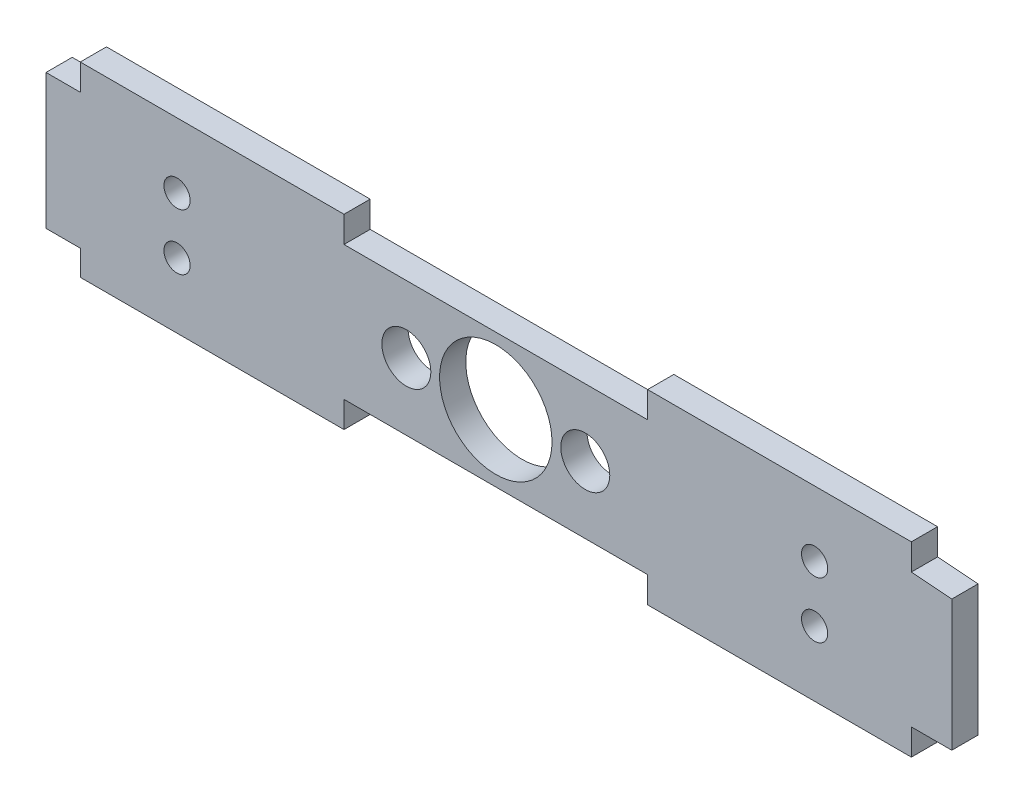
ISO-10303-21;
HEADER;
FILE_DESCRIPTION(('STEP AP214'),'2;1');
FILE_NAME('part.step','',(''),(''),'','','');
FILE_SCHEMA(('AUTOMOTIVE_DESIGN { 1 0 10303 214 1 1 1 1 }'));
ENDSEC;
DATA;
#1=APPLICATION_CONTEXT('core data for automotive mechanical design processes');
#2=APPLICATION_PROTOCOL_DEFINITION('international standard','automotive_design',2000,#1);
#3=PRODUCT_CONTEXT('',#1,'mechanical');
#4=PRODUCT('Part','Part','',(#3));
#5=PRODUCT_RELATED_PRODUCT_CATEGORY('part','',(#4));
#6=PRODUCT_DEFINITION_FORMATION('','',#4);
#7=PRODUCT_DEFINITION_CONTEXT('part definition',#1,'design');
#8=PRODUCT_DEFINITION('design','',#6,#7);
#9=PRODUCT_DEFINITION_SHAPE('','',#8);
#10=(LENGTH_UNIT() NAMED_UNIT(*) SI_UNIT(.MILLI.,.METRE.));
#11=(NAMED_UNIT(*) PLANE_ANGLE_UNIT() SI_UNIT($,.RADIAN.));
#12=(NAMED_UNIT(*) SI_UNIT($,.STERADIAN.) SOLID_ANGLE_UNIT());
#13=UNCERTAINTY_MEASURE_WITH_UNIT(LENGTH_MEASURE(1.E-05),#10,'distance_accuracy_value','');
#14=(GEOMETRIC_REPRESENTATION_CONTEXT(3) GLOBAL_UNCERTAINTY_ASSIGNED_CONTEXT((#13)) GLOBAL_UNIT_ASSIGNED_CONTEXT((#10,
#11,#12)) REPRESENTATION_CONTEXT('',''));
#15=CARTESIAN_POINT('',(0.,0.,0.));
#16=DIRECTION('',(0.,0.,1.));
#17=DIRECTION('',(1.,0.,0.));
#18=AXIS2_PLACEMENT_3D('',#15,#16,#17);
#19=CARTESIAN_POINT('',(-22.3101445281848,0.,5.08));
#20=DIRECTION('',(-1.,0.,0.));
#21=DIRECTION('',(0.,0.,1.));
#22=AXIS2_PLACEMENT_3D('',#19,#20,#21);
#23=PLANE('',#22);
#24=DIRECTION('',(0.,1.,0.));
#25=VECTOR('',#24,1.);
#26=CARTESIAN_POINT('',(-22.3101445281848,0.,0.));
#27=LINE('',#26,#25);
#28=CARTESIAN_POINT('',(-22.3101445281848,-25.7868973944509,0.));
#29=VERTEX_POINT('',#28);
#30=CARTESIAN_POINT('',(-22.3101445281848,-20.7068973944509,0.));
#31=VERTEX_POINT('',#30);
#32=EDGE_CURVE('E226',#29,#31,#27,.T.);
#33=ORIENTED_EDGE('',*,*,#32,.T.);
#34=DIRECTION('',(0.,0.,-1.));
#35=VECTOR('',#34,1.);
#36=CARTESIAN_POINT('',(-22.3101445281848,-20.7068973944509,5.08));
#37=LINE('',#36,#35);
#38=CARTESIAN_POINT('',(-22.3101445281848,-20.7068973944509,5.08));
#39=VERTEX_POINT('',#38);
#40=EDGE_CURVE('E11',#39,#31,#37,.T.);
#41=ORIENTED_EDGE('',*,*,#40,.F.);
#42=DIRECTION('',(0.,1.,0.));
#43=VECTOR('',#42,1.);
#44=CARTESIAN_POINT('',(-22.3101445281848,0.,5.08));
#45=LINE('',#44,#43);
#46=CARTESIAN_POINT('',(-22.3101445281848,-25.7868973944509,5.08));
#47=VERTEX_POINT('',#46);
#48=EDGE_CURVE('E387',#47,#39,#45,.T.);
#49=ORIENTED_EDGE('',*,*,#48,.F.);
#50=DIRECTION('',(0.,0.,-1.));
#51=VECTOR('',#50,1.);
#52=CARTESIAN_POINT('',(-22.3101445281848,-25.7868973944509,5.08));
#53=LINE('',#52,#51);
#54=EDGE_CURVE('E219',#47,#29,#53,.T.);
#55=ORIENTED_EDGE('',*,*,#54,.T.);
#56=EDGE_LOOP('',(#33,#41,#49,#55));
#57=FACE_BOUND('',#56,.T.);
#58=ADVANCED_FACE('F35',(#57),#23,.F.);
#59=CARTESIAN_POINT('',(0.,-20.7068973944509,5.08));
#60=DIRECTION('',(0.,-1.,0.));
#61=DIRECTION('',(0.,0.,-1.));
#62=AXIS2_PLACEMENT_3D('',#59,#60,#61);
#63=PLANE('',#62);
#64=DIRECTION('',(-1.,0.,0.));
#65=VECTOR('',#64,1.);
#66=CARTESIAN_POINT('',(0.,-20.7068973944509,0.));
#67=LINE('',#66,#65);
#68=CARTESIAN_POINT('',(-73.4438574464147,-20.7068973944509,0.));
#69=VERTEX_POINT('',#68);
#70=EDGE_CURVE('E229',#31,#69,#67,.T.);
#71=ORIENTED_EDGE('',*,*,#70,.T.);
#72=DIRECTION('',(0.,0.,-1.));
#73=VECTOR('',#72,1.);
#74=CARTESIAN_POINT('',(-73.4438574464147,-20.7068973944509,5.08));
#75=LINE('',#74,#73);
#76=CARTESIAN_POINT('',(-73.4438574464147,-20.7068973944509,5.08));
#77=VERTEX_POINT('',#76);
#78=EDGE_CURVE('E44',#77,#69,#75,.T.);
#79=ORIENTED_EDGE('',*,*,#78,.F.);
#80=DIRECTION('',(-1.,0.,0.));
#81=VECTOR('',#80,1.);
#82=CARTESIAN_POINT('',(0.,-20.7068973944509,5.08));
#83=LINE('',#82,#81);
#84=EDGE_CURVE('E131',#39,#77,#83,.T.);
#85=ORIENTED_EDGE('',*,*,#84,.F.);
#86=ORIENTED_EDGE('',*,*,#40,.T.);
#87=EDGE_LOOP('',(#71,#79,#85,#86));
#88=FACE_BOUND('',#87,.T.);
#89=ADVANCED_FACE('F403',(#88),#63,.F.);
#90=CARTESIAN_POINT('',(-73.4438574464147,0.,5.08));
#91=DIRECTION('',(1.,0.,0.));
#92=DIRECTION('',(0.,0.,-1.));
#93=AXIS2_PLACEMENT_3D('',#90,#91,#92);
#94=PLANE('',#93);
#95=DIRECTION('',(0.,-1.,0.));
#96=VECTOR('',#95,1.);
#97=CARTESIAN_POINT('',(-73.4438574464147,0.,0.));
#98=LINE('',#97,#96);
#99=CARTESIAN_POINT('',(-73.4438574464147,-25.7868973944509,0.));
#100=VERTEX_POINT('',#99);
#101=EDGE_CURVE('E231',#69,#100,#98,.T.);
#102=ORIENTED_EDGE('',*,*,#101,.T.);
#103=DIRECTION('',(0.,0.,-1.));
#104=VECTOR('',#103,1.);
#105=CARTESIAN_POINT('',(-73.4438574464147,-25.7868973944509,5.08));
#106=LINE('',#105,#104);
#107=CARTESIAN_POINT('',(-73.4438574464147,-25.7868973944509,5.08));
#108=VERTEX_POINT('',#107);
#109=EDGE_CURVE('E322',#108,#100,#106,.T.);
#110=ORIENTED_EDGE('',*,*,#109,.F.);
#111=DIRECTION('',(0.,-1.,0.));
#112=VECTOR('',#111,1.);
#113=CARTESIAN_POINT('',(-73.4438574464147,0.,5.08));
#114=LINE('',#113,#112);
#115=EDGE_CURVE('E330',#77,#108,#114,.T.);
#116=ORIENTED_EDGE('',*,*,#115,.F.);
#117=ORIENTED_EDGE('',*,*,#78,.T.);
#118=EDGE_LOOP('',(#102,#110,#116,#117));
#119=FACE_BOUND('',#118,.T.);
#120=ADVANCED_FACE('F328',(#119),#94,.F.);
#121=CARTESIAN_POINT('',(0.,-25.7868973944509,5.08));
#122=DIRECTION('',(0.,-1.,0.));
#123=DIRECTION('',(0.,0.,-1.));
#124=AXIS2_PLACEMENT_3D('',#121,#122,#123);
#125=PLANE('',#124);
#126=DIRECTION('',(-1.,0.,0.));
#127=VECTOR('',#126,1.);
#128=CARTESIAN_POINT('',(0.,-25.7868973944509,0.));
#129=LINE('',#128,#127);
#130=CARTESIAN_POINT('',(-80.0879049182557,-25.7868973944509,0.));
#131=VERTEX_POINT('',#130);
#132=EDGE_CURVE('E233',#100,#131,#129,.T.);
#133=ORIENTED_EDGE('',*,*,#132,.T.);
#134=DIRECTION('',(0.,0.,-1.));
#135=VECTOR('',#134,1.);
#136=CARTESIAN_POINT('',(-80.0879049182557,-25.7868973944509,5.08));
#137=LINE('',#136,#135);
#138=CARTESIAN_POINT('',(-80.0879049182557,-25.7868973944509,5.08));
#139=VERTEX_POINT('',#138);
#140=EDGE_CURVE('E319',#139,#131,#137,.T.);
#141=ORIENTED_EDGE('',*,*,#140,.F.);
#142=DIRECTION('',(-1.,0.,0.));
#143=VECTOR('',#142,1.);
#144=CARTESIAN_POINT('',(0.,-25.7868973944509,5.08));
#145=LINE('',#144,#143);
#146=EDGE_CURVE('E349',#108,#139,#145,.T.);
#147=ORIENTED_EDGE('',*,*,#146,.F.);
#148=ORIENTED_EDGE('',*,*,#109,.T.);
#149=EDGE_LOOP('',(#133,#141,#147,#148));
#150=FACE_BOUND('',#149,.T.);
#151=ADVANCED_FACE('F340',(#150),#125,.F.);
#152=CARTESIAN_POINT('',(-80.0879049182557,0.,5.08));
#153=DIRECTION('',(1.,0.,0.));
#154=DIRECTION('',(0.,0.,-1.));
#155=AXIS2_PLACEMENT_3D('',#152,#153,#154);
#156=PLANE('',#155);
#157=DIRECTION('',(0.,-1.,0.));
#158=VECTOR('',#157,1.);
#159=CARTESIAN_POINT('',(-80.0879049182557,0.,0.));
#160=LINE('',#159,#158);
#161=CARTESIAN_POINT('',(-80.0879049182557,-51.975164852653,0.));
#162=VERTEX_POINT('',#161);
#163=EDGE_CURVE('E235',#131,#162,#160,.T.);
#164=ORIENTED_EDGE('',*,*,#163,.T.);
#165=DIRECTION('',(0.,0.,-1.));
#166=VECTOR('',#165,1.);
#167=CARTESIAN_POINT('',(-80.0879049182557,-51.975164852653,5.08));
#168=LINE('',#167,#166);
#169=CARTESIAN_POINT('',(-80.0879049182557,-51.975164852653,5.08));
#170=VERTEX_POINT('',#169);
#171=EDGE_CURVE('E316',#170,#162,#168,.T.);
#172=ORIENTED_EDGE('',*,*,#171,.F.);
#173=DIRECTION('',(0.,-1.,0.));
#174=VECTOR('',#173,1.);
#175=CARTESIAN_POINT('',(-80.0879049182557,0.,5.08));
#176=LINE('',#175,#174);
#177=EDGE_CURVE('E346',#139,#170,#176,.T.);
#178=ORIENTED_EDGE('',*,*,#177,.F.);
#179=ORIENTED_EDGE('',*,*,#140,.T.);
#180=EDGE_LOOP('',(#164,#172,#178,#179));
#181=FACE_BOUND('',#180,.T.);
#182=ADVANCED_FACE('F344',(#181),#156,.F.);
#183=CARTESIAN_POINT('',(0.,-51.975164852653,5.08));
#184=DIRECTION('',(0.,1.,0.));
#185=DIRECTION('',(0.,0.,1.));
#186=AXIS2_PLACEMENT_3D('',#183,#184,#185);
#187=PLANE('',#186);
#188=DIRECTION('',(1.,0.,0.));
#189=VECTOR('',#188,1.);
#190=CARTESIAN_POINT('',(0.,-51.975164852653,0.));
#191=LINE('',#190,#189);
#192=CARTESIAN_POINT('',(-73.4438574464147,-51.975164852653,0.));
#193=VERTEX_POINT('',#192);
#194=EDGE_CURVE('E237',#162,#193,#191,.T.);
#195=ORIENTED_EDGE('',*,*,#194,.T.);
#196=DIRECTION('',(0.,0.,-1.));
#197=VECTOR('',#196,1.);
#198=CARTESIAN_POINT('',(-73.4438574464147,-51.975164852653,5.08));
#199=LINE('',#198,#197);
#200=CARTESIAN_POINT('',(-73.4438574464147,-51.975164852653,5.08));
#201=VERTEX_POINT('',#200);
#202=EDGE_CURVE('E313',#201,#193,#199,.T.);
#203=ORIENTED_EDGE('',*,*,#202,.F.);
#204=DIRECTION('',(1.,0.,0.));
#205=VECTOR('',#204,1.);
#206=CARTESIAN_POINT('',(0.,-51.975164852653,5.08));
#207=LINE('',#206,#205);
#208=EDGE_CURVE('E348',#170,#201,#207,.T.);
#209=ORIENTED_EDGE('',*,*,#208,.F.);
#210=ORIENTED_EDGE('',*,*,#171,.T.);
#211=EDGE_LOOP('',(#195,#203,#209,#210));
#212=FACE_BOUND('',#211,.T.);
#213=ADVANCED_FACE('F416',(#212),#187,.F.);
#214=CARTESIAN_POINT('',(-73.453283826461,-0.0133251357682893,5.08));
#215=DIRECTION('',(0.999999983545267,0.000181409664141217,0.));
#216=DIRECTION('',(-0.000181409664141217,0.999999983545267,0.));
#217=AXIS2_PLACEMENT_3D('',#214,#215,#216);
#218=PLANE('',#217);
#219=DIRECTION('',(0.000181409664141217,-0.999999983545267,0.));
#220=VECTOR('',#219,1.);
#221=CARTESIAN_POINT('',(-73.453283826461,-0.0133251357682893,0.));
#222=LINE('',#221,#220);
#223=CARTESIAN_POINT('',(-73.4429700388426,-56.8668973944509,0.));
#224=VERTEX_POINT('',#223);
#225=EDGE_CURVE('E239',#193,#224,#222,.T.);
#226=ORIENTED_EDGE('',*,*,#225,.T.);
#227=DIRECTION('',(0.,0.,-1.));
#228=VECTOR('',#227,1.);
#229=CARTESIAN_POINT('',(-73.4429700388426,-56.8668973944509,5.08));
#230=LINE('',#229,#228);
#231=CARTESIAN_POINT('',(-73.4429700388426,-56.8668973944509,5.08));
#232=VERTEX_POINT('',#231);
#233=EDGE_CURVE('E310',#232,#224,#230,.T.);
#234=ORIENTED_EDGE('',*,*,#233,.F.);
#235=DIRECTION('',(0.000181409664141217,-0.999999983545267,0.));
#236=VECTOR('',#235,1.);
#237=CARTESIAN_POINT('',(-73.453283826461,-0.0133251357682893,5.08));
#238=LINE('',#237,#236);
#239=EDGE_CURVE('E351',#201,#232,#238,.T.);
#240=ORIENTED_EDGE('',*,*,#239,.F.);
#241=ORIENTED_EDGE('',*,*,#202,.T.);
#242=EDGE_LOOP('',(#226,#234,#240,#241));
#243=FACE_BOUND('',#242,.T.);
#244=ADVANCED_FACE('F419',(#243),#218,.F.);
#245=CARTESIAN_POINT('',(0.,-56.8668973944509,5.08));
#246=DIRECTION('',(0.,1.,0.));
#247=DIRECTION('',(0.,0.,1.));
#248=AXIS2_PLACEMENT_3D('',#245,#246,#247);
#249=PLANE('',#248);
#250=DIRECTION('',(1.,0.,0.));
#251=VECTOR('',#250,1.);
#252=CARTESIAN_POINT('',(0.,-56.8668973944509,0.));
#253=LINE('',#252,#251);
#254=CARTESIAN_POINT('',(-22.3092571206128,-56.8668973944509,0.));
#255=VERTEX_POINT('',#254);
#256=EDGE_CURVE('E241',#224,#255,#253,.T.);
#257=ORIENTED_EDGE('',*,*,#256,.T.);
#258=DIRECTION('',(0.,0.,-1.));
#259=VECTOR('',#258,1.);
#260=CARTESIAN_POINT('',(-22.3092571206128,-56.8668973944509,5.08));
#261=LINE('',#260,#259);
#262=CARTESIAN_POINT('',(-22.3092571206128,-56.8668973944509,5.08));
#263=VERTEX_POINT('',#262);
#264=EDGE_CURVE('E307',#263,#255,#261,.T.);
#265=ORIENTED_EDGE('',*,*,#264,.F.);
#266=DIRECTION('',(1.,0.,0.));
#267=VECTOR('',#266,1.);
#268=CARTESIAN_POINT('',(0.,-56.8668973944509,5.08));
#269=LINE('',#268,#267);
#270=EDGE_CURVE('E357',#232,#263,#269,.T.);
#271=ORIENTED_EDGE('',*,*,#270,.F.);
#272=ORIENTED_EDGE('',*,*,#233,.T.);
#273=EDGE_LOOP('',(#257,#265,#271,#272));
#274=FACE_BOUND('',#273,.T.);
#275=ADVANCED_FACE('F423',(#274),#249,.F.);
#276=CARTESIAN_POINT('',(-22.3092571206128,0.,5.08));
#277=DIRECTION('',(-1.,0.,0.));
#278=DIRECTION('',(0.,0.,1.));
#279=AXIS2_PLACEMENT_3D('',#276,#277,#278);
#280=PLANE('',#279);
#281=DIRECTION('',(0.,1.,0.));
#282=VECTOR('',#281,1.);
#283=CARTESIAN_POINT('',(-22.3092571206128,0.,0.));
#284=LINE('',#283,#282);
#285=CARTESIAN_POINT('',(-22.3092571206128,-51.7868973944509,0.));
#286=VERTEX_POINT('',#285);
#287=EDGE_CURVE('E243',#255,#286,#284,.T.);
#288=ORIENTED_EDGE('',*,*,#287,.T.);
#289=DIRECTION('',(0.,0.,-1.));
#290=VECTOR('',#289,1.);
#291=CARTESIAN_POINT('',(-22.3092571206128,-51.7868973944509,5.08));
#292=LINE('',#291,#290);
#293=CARTESIAN_POINT('',(-22.3092571206128,-51.7868973944509,5.08));
#294=VERTEX_POINT('',#293);
#295=EDGE_CURVE('E304',#294,#286,#292,.T.);
#296=ORIENTED_EDGE('',*,*,#295,.F.);
#297=DIRECTION('',(0.,1.,0.));
#298=VECTOR('',#297,1.);
#299=CARTESIAN_POINT('',(-22.3092571206128,0.,5.08));
#300=LINE('',#299,#298);
#301=EDGE_CURVE('E359',#263,#294,#300,.T.);
#302=ORIENTED_EDGE('',*,*,#301,.F.);
#303=ORIENTED_EDGE('',*,*,#264,.T.);
#304=EDGE_LOOP('',(#288,#296,#302,#303));
#305=FACE_BOUND('',#304,.T.);
#306=ADVANCED_FACE('F427',(#305),#280,.F.);
#307=CARTESIAN_POINT('',(0.,-51.7868973944509,5.08));
#308=DIRECTION('',(0.,1.,0.));
#309=DIRECTION('',(0.,0.,1.));
#310=AXIS2_PLACEMENT_3D('',#307,#308,#309);
#311=PLANE('',#310);
#312=DIRECTION('',(1.,0.,0.));
#313=VECTOR('',#312,1.);
#314=CARTESIAN_POINT('',(0.,-51.7868973944509,0.));
#315=LINE('',#314,#313);
#316=CARTESIAN_POINT('',(36.5607676051531,-51.7868973944509,0.));
#317=VERTEX_POINT('',#316);
#318=EDGE_CURVE('E245',#286,#317,#315,.T.);
#319=ORIENTED_EDGE('',*,*,#318,.T.);
#320=DIRECTION('',(0.,0.,-1.));
#321=VECTOR('',#320,1.);
#322=CARTESIAN_POINT('',(36.5607676051531,-51.7868973944509,5.08));
#323=LINE('',#322,#321);
#324=CARTESIAN_POINT('',(36.5607676051531,-51.7868973944509,5.08));
#325=VERTEX_POINT('',#324);
#326=EDGE_CURVE('E301',#325,#317,#323,.T.);
#327=ORIENTED_EDGE('',*,*,#326,.F.);
#328=DIRECTION('',(1.,0.,0.));
#329=VECTOR('',#328,1.);
#330=CARTESIAN_POINT('',(0.,-51.7868973944509,5.08));
#331=LINE('',#330,#329);
#332=EDGE_CURVE('E361',#294,#325,#331,.T.);
#333=ORIENTED_EDGE('',*,*,#332,.F.);
#334=ORIENTED_EDGE('',*,*,#295,.T.);
#335=EDGE_LOOP('',(#319,#327,#333,#334));
#336=FACE_BOUND('',#335,.T.);
#337=ADVANCED_FACE('F431',(#336),#311,.F.);
#338=CARTESIAN_POINT('',(36.5607676051531,0.,5.08));
#339=DIRECTION('',(1.,0.,0.));
#340=DIRECTION('',(0.,0.,-1.));
#341=AXIS2_PLACEMENT_3D('',#338,#339,#340);
#342=PLANE('',#341);
#343=DIRECTION('',(0.,-1.,0.));
#344=VECTOR('',#343,1.);
#345=CARTESIAN_POINT('',(36.5607676051531,0.,0.));
#346=LINE('',#345,#344);
#347=CARTESIAN_POINT('',(36.5607676051531,-56.8668973944509,0.));
#348=VERTEX_POINT('',#347);
#349=EDGE_CURVE('E247',#317,#348,#346,.T.);
#350=ORIENTED_EDGE('',*,*,#349,.T.);
#351=DIRECTION('',(0.,0.,-1.));
#352=VECTOR('',#351,1.);
#353=CARTESIAN_POINT('',(36.5607676051531,-56.8668973944509,5.08));
#354=LINE('',#353,#352);
#355=CARTESIAN_POINT('',(36.5607676051531,-56.8668973944509,5.08));
#356=VERTEX_POINT('',#355);
#357=EDGE_CURVE('E298',#356,#348,#354,.T.);
#358=ORIENTED_EDGE('',*,*,#357,.F.);
#359=DIRECTION('',(0.,-1.,0.));
#360=VECTOR('',#359,1.);
#361=CARTESIAN_POINT('',(36.5607676051531,0.,5.08));
#362=LINE('',#361,#360);
#363=EDGE_CURVE('E363',#325,#356,#362,.T.);
#364=ORIENTED_EDGE('',*,*,#363,.F.);
#365=ORIENTED_EDGE('',*,*,#326,.T.);
#366=EDGE_LOOP('',(#350,#358,#364,#365));
#367=FACE_BOUND('',#366,.T.);
#368=ADVANCED_FACE('F435',(#367),#342,.F.);
#369=CARTESIAN_POINT('',(0.,-56.8668973944509,5.08));
#370=DIRECTION('',(0.,1.,0.));
#371=DIRECTION('',(0.,0.,1.));
#372=AXIS2_PLACEMENT_3D('',#369,#370,#371);
#373=PLANE('',#372);
#374=DIRECTION('',(1.,0.,0.));
#375=VECTOR('',#374,1.);
#376=CARTESIAN_POINT('',(0.,-56.8668973944509,0.));
#377=LINE('',#376,#375);
#378=CARTESIAN_POINT('',(87.6944805233829,-56.8668973944509,0.));
#379=VERTEX_POINT('',#378);
#380=EDGE_CURVE('E249',#348,#379,#377,.T.);
#381=ORIENTED_EDGE('',*,*,#380,.T.);
#382=DIRECTION('',(0.,0.,-1.));
#383=VECTOR('',#382,1.);
#384=CARTESIAN_POINT('',(87.6944805233829,-56.8668973944509,5.08));
#385=LINE('',#384,#383);
#386=CARTESIAN_POINT('',(87.6944805233829,-56.8668973944509,5.08));
#387=VERTEX_POINT('',#386);
#388=EDGE_CURVE('E295',#387,#379,#385,.T.);
#389=ORIENTED_EDGE('',*,*,#388,.F.);
#390=DIRECTION('',(1.,0.,0.));
#391=VECTOR('',#390,1.);
#392=CARTESIAN_POINT('',(0.,-56.8668973944509,5.08));
#393=LINE('',#392,#391);
#394=EDGE_CURVE('E365',#356,#387,#393,.T.);
#395=ORIENTED_EDGE('',*,*,#394,.F.);
#396=ORIENTED_EDGE('',*,*,#357,.T.);
#397=EDGE_LOOP('',(#381,#389,#395,#396));
#398=FACE_BOUND('',#397,.T.);
#399=ADVANCED_FACE('F439',(#398),#373,.F.);
#400=CARTESIAN_POINT('',(87.6944805233829,0.,5.08));
#401=DIRECTION('',(-1.,0.,0.));
#402=DIRECTION('',(0.,0.,1.));
#403=AXIS2_PLACEMENT_3D('',#400,#401,#402);
#404=PLANE('',#403);
#405=DIRECTION('',(0.,1.,0.));
#406=VECTOR('',#405,1.);
#407=CARTESIAN_POINT('',(87.6944805233829,0.,0.));
#408=LINE('',#407,#406);
#409=CARTESIAN_POINT('',(87.6944805233829,-51.7868973944509,0.));
#410=VERTEX_POINT('',#409);
#411=EDGE_CURVE('E251',#379,#410,#408,.T.);
#412=ORIENTED_EDGE('',*,*,#411,.T.);
#413=DIRECTION('',(0.,0.,-1.));
#414=VECTOR('',#413,1.);
#415=CARTESIAN_POINT('',(87.6944805233829,-51.7868973944509,5.08));
#416=LINE('',#415,#414);
#417=CARTESIAN_POINT('',(87.6944805233829,-51.7868973944509,5.08));
#418=VERTEX_POINT('',#417);
#419=EDGE_CURVE('E292',#418,#410,#416,.T.);
#420=ORIENTED_EDGE('',*,*,#419,.F.);
#421=DIRECTION('',(0.,1.,0.));
#422=VECTOR('',#421,1.);
#423=CARTESIAN_POINT('',(87.6944805233829,0.,5.08));
#424=LINE('',#423,#422);
#425=EDGE_CURVE('E367',#387,#418,#424,.T.);
#426=ORIENTED_EDGE('',*,*,#425,.F.);
#427=ORIENTED_EDGE('',*,*,#388,.T.);
#428=EDGE_LOOP('',(#412,#420,#426,#427));
#429=FACE_BOUND('',#428,.T.);
#430=ADVANCED_FACE('F443',(#429),#404,.F.);
#431=CARTESIAN_POINT('',(0.,-51.7868973944509,5.08));
#432=DIRECTION('',(0.,1.,0.));
#433=DIRECTION('',(0.,0.,1.));
#434=AXIS2_PLACEMENT_3D('',#431,#432,#433);
#435=PLANE('',#434);
#436=DIRECTION('',(1.,0.,0.));
#437=VECTOR('',#436,1.);
#438=CARTESIAN_POINT('',(0.,-51.7868973944509,0.));
#439=LINE('',#438,#437);
#440=CARTESIAN_POINT('',(95.5356855753564,-51.7868973944509,0.));
#441=VERTEX_POINT('',#440);
#442=EDGE_CURVE('E253',#410,#441,#439,.T.);
#443=ORIENTED_EDGE('',*,*,#442,.T.);
#444=DIRECTION('',(0.,0.,-1.));
#445=VECTOR('',#444,1.);
#446=CARTESIAN_POINT('',(95.5356855753564,-51.7868973944509,5.08));
#447=LINE('',#446,#445);
#448=CARTESIAN_POINT('',(95.5356855753564,-51.7868973944509,5.08));
#449=VERTEX_POINT('',#448);
#450=EDGE_CURVE('E289',#449,#441,#447,.T.);
#451=ORIENTED_EDGE('',*,*,#450,.F.);
#452=DIRECTION('',(1.,0.,0.));
#453=VECTOR('',#452,1.);
#454=CARTESIAN_POINT('',(0.,-51.7868973944509,5.08));
#455=LINE('',#454,#453);
#456=EDGE_CURVE('E369',#418,#449,#455,.T.);
#457=ORIENTED_EDGE('',*,*,#456,.F.);
#458=ORIENTED_EDGE('',*,*,#419,.T.);
#459=EDGE_LOOP('',(#443,#451,#457,#458));
#460=FACE_BOUND('',#459,.T.);
#461=ADVANCED_FACE('F447',(#460),#435,.F.);
#462=CARTESIAN_POINT('',(95.5356855753564,0.,5.08));
#463=DIRECTION('',(-1.,0.,0.));
#464=DIRECTION('',(0.,0.,1.));
#465=AXIS2_PLACEMENT_3D('',#462,#463,#464);
#466=PLANE('',#465);
#467=DIRECTION('',(0.,1.,0.));
#468=VECTOR('',#467,1.);
#469=CARTESIAN_POINT('',(95.5356855753564,0.,0.));
#470=LINE('',#469,#468);
#471=CARTESIAN_POINT('',(95.5356855753564,-26.3958134780182,0.));
#472=VERTEX_POINT('',#471);
#473=EDGE_CURVE('E255',#441,#472,#470,.T.);
#474=ORIENTED_EDGE('',*,*,#473,.T.);
#475=DIRECTION('',(0.,0.,-1.));
#476=VECTOR('',#475,1.);
#477=CARTESIAN_POINT('',(95.5356855753564,-26.3958134780182,5.08));
#478=LINE('',#477,#476);
#479=CARTESIAN_POINT('',(95.5356855753564,-26.3958134780182,5.08));
#480=VERTEX_POINT('',#479);
#481=EDGE_CURVE('E286',#480,#472,#478,.T.);
#482=ORIENTED_EDGE('',*,*,#481,.F.);
#483=DIRECTION('',(0.,1.,0.));
#484=VECTOR('',#483,1.);
#485=CARTESIAN_POINT('',(95.5356855753564,0.,5.08));
#486=LINE('',#485,#484);
#487=EDGE_CURVE('E371',#449,#480,#486,.T.);
#488=ORIENTED_EDGE('',*,*,#487,.F.);
#489=ORIENTED_EDGE('',*,*,#450,.T.);
#490=EDGE_LOOP('',(#474,#482,#488,#489));
#491=FACE_BOUND('',#490,.T.);
#492=ADVANCED_FACE('F451',(#491),#466,.F.);
#493=CARTESIAN_POINT('',(-1.46473632780482,-18.8640077368406,5.08));
#494=DIRECTION('',(-0.0774141268891876,-0.996999023549163,0.));
#495=DIRECTION('',(0.996999023549163,-0.0774141268891876,0.));
#496=AXIS2_PLACEMENT_3D('',#493,#494,#495);
#497=PLANE('',#496);
#498=DIRECTION('',(-0.996999023549163,0.0774141268891876,0.));
#499=VECTOR('',#498,1.);
#500=CARTESIAN_POINT('',(-1.46473632780482,-18.8640077368406,0.));
#501=LINE('',#500,#499);
#502=CARTESIAN_POINT('',(87.6935931158109,-25.7868973944509,0.));
#503=VERTEX_POINT('',#502);
#504=EDGE_CURVE('E257',#472,#503,#501,.T.);
#505=ORIENTED_EDGE('',*,*,#504,.T.);
#506=DIRECTION('',(0.,0.,-1.));
#507=VECTOR('',#506,1.);
#508=CARTESIAN_POINT('',(87.6935931158109,-25.7868973944509,5.08));
#509=LINE('',#508,#507);
#510=CARTESIAN_POINT('',(87.6935931158109,-25.7868973944509,5.08));
#511=VERTEX_POINT('',#510);
#512=EDGE_CURVE('E283',#511,#503,#509,.T.);
#513=ORIENTED_EDGE('',*,*,#512,.F.);
#514=DIRECTION('',(-0.996999023549163,0.0774141268891876,0.));
#515=VECTOR('',#514,1.);
#516=CARTESIAN_POINT('',(-1.46473632780482,-18.8640077368406,5.08));
#517=LINE('',#516,#515);
#518=EDGE_CURVE('E373',#480,#511,#517,.T.);
#519=ORIENTED_EDGE('',*,*,#518,.F.);
#520=ORIENTED_EDGE('',*,*,#481,.T.);
#521=EDGE_LOOP('',(#505,#513,#519,#520));
#522=FACE_BOUND('',#521,.T.);
#523=ADVANCED_FACE('F379',(#522),#497,.F.);
#524=CARTESIAN_POINT('',(87.6935931158109,0.,5.08));
#525=DIRECTION('',(-1.,0.,0.));
#526=DIRECTION('',(0.,0.,1.));
#527=AXIS2_PLACEMENT_3D('',#524,#525,#526);
#528=PLANE('',#527);
#529=DIRECTION('',(0.,1.,0.));
#530=VECTOR('',#529,1.);
#531=CARTESIAN_POINT('',(87.6935931158109,0.,0.));
#532=LINE('',#531,#530);
#533=CARTESIAN_POINT('',(87.6935931158109,-20.7068973944509,0.));
#534=VERTEX_POINT('',#533);
#535=EDGE_CURVE('E259',#503,#534,#532,.T.);
#536=ORIENTED_EDGE('',*,*,#535,.T.);
#537=DIRECTION('',(0.,0.,-1.));
#538=VECTOR('',#537,1.);
#539=CARTESIAN_POINT('',(87.6935931158109,-20.7068973944509,5.08));
#540=LINE('',#539,#538);
#541=CARTESIAN_POINT('',(87.6935931158109,-20.7068973944509,5.08));
#542=VERTEX_POINT('',#541);
#543=EDGE_CURVE('E196',#542,#534,#540,.T.);
#544=ORIENTED_EDGE('',*,*,#543,.F.);
#545=DIRECTION('',(0.,1.,0.));
#546=VECTOR('',#545,1.);
#547=CARTESIAN_POINT('',(87.6935931158109,0.,5.08));
#548=LINE('',#547,#546);
#549=EDGE_CURVE('E187',#511,#542,#548,.T.);
#550=ORIENTED_EDGE('',*,*,#549,.F.);
#551=ORIENTED_EDGE('',*,*,#512,.T.);
#552=EDGE_LOOP('',(#536,#544,#550,#551));
#553=FACE_BOUND('',#552,.T.);
#554=ADVANCED_FACE('F383',(#553),#528,.F.);
#555=CARTESIAN_POINT('',(0.,-20.7068973944509,5.08));
#556=DIRECTION('',(0.,-1.,0.));
#557=DIRECTION('',(0.,0.,-1.));
#558=AXIS2_PLACEMENT_3D('',#555,#556,#557);
#559=PLANE('',#558);
#560=DIRECTION('',(-1.,0.,0.));
#561=VECTOR('',#560,1.);
#562=CARTESIAN_POINT('',(0.,-20.7068973944509,0.));
#563=LINE('',#562,#561);
#564=CARTESIAN_POINT('',(36.5598801975811,-20.7068973944509,0.));
#565=VERTEX_POINT('',#564);
#566=EDGE_CURVE('E195',#534,#565,#563,.T.);
#567=ORIENTED_EDGE('',*,*,#566,.T.);
#568=DIRECTION('',(0.,0.,-1.));
#569=VECTOR('',#568,1.);
#570=CARTESIAN_POINT('',(36.5598801975811,-20.7068973944509,5.08));
#571=LINE('',#570,#569);
#572=CARTESIAN_POINT('',(36.5598801975811,-20.7068973944509,5.08));
#573=VERTEX_POINT('',#572);
#574=EDGE_CURVE('E192',#573,#565,#571,.T.);
#575=ORIENTED_EDGE('',*,*,#574,.F.);
#576=DIRECTION('',(-1.,0.,0.));
#577=VECTOR('',#576,1.);
#578=CARTESIAN_POINT('',(0.,-20.7068973944509,5.08));
#579=LINE('',#578,#577);
#580=EDGE_CURVE('E180',#542,#573,#579,.T.);
#581=ORIENTED_EDGE('',*,*,#580,.F.);
#582=ORIENTED_EDGE('',*,*,#543,.T.);
#583=EDGE_LOOP('',(#567,#575,#581,#582));
#584=FACE_BOUND('',#583,.T.);
#585=ADVANCED_FACE('F193',(#584),#559,.F.);
#586=CARTESIAN_POINT('',(36.5598801975811,0.,5.08));
#587=DIRECTION('',(1.,0.,0.));
#588=DIRECTION('',(0.,0.,-1.));
#589=AXIS2_PLACEMENT_3D('',#586,#587,#588);
#590=PLANE('',#589);
#591=DIRECTION('',(0.,-1.,0.));
#592=VECTOR('',#591,1.);
#593=CARTESIAN_POINT('',(36.5598801975811,0.,0.));
#594=LINE('',#593,#592);
#595=CARTESIAN_POINT('',(36.5598801975811,-25.7868973944509,0.));
#596=VERTEX_POINT('',#595);
#597=EDGE_CURVE('E117',#565,#596,#594,.T.);
#598=ORIENTED_EDGE('',*,*,#597,.T.);
#599=DIRECTION('',(0.,0.,-1.));
#600=VECTOR('',#599,1.);
#601=CARTESIAN_POINT('',(36.5598801975811,-25.7868973944509,5.08));
#602=LINE('',#601,#600);
#603=CARTESIAN_POINT('',(36.5598801975811,-25.7868973944509,5.08));
#604=VERTEX_POINT('',#603);
#605=EDGE_CURVE('E197',#604,#596,#602,.T.);
#606=ORIENTED_EDGE('',*,*,#605,.F.);
#607=DIRECTION('',(0.,-1.,0.));
#608=VECTOR('',#607,1.);
#609=CARTESIAN_POINT('',(36.5598801975811,0.,5.08));
#610=LINE('',#609,#608);
#611=EDGE_CURVE('E185',#573,#604,#610,.T.);
#612=ORIENTED_EDGE('',*,*,#611,.F.);
#613=ORIENTED_EDGE('',*,*,#574,.T.);
#614=EDGE_LOOP('',(#598,#606,#612,#613));
#615=FACE_BOUND('',#614,.T.);
#616=ADVANCED_FACE('F199',(#615),#590,.F.);
#617=CARTESIAN_POINT('',(68.936199960363,-44.2369039779583,5.08));
#618=DIRECTION('',(0.,0.,-1.));
#619=DIRECTION('',(-1.,0.,0.));
#620=AXIS2_PLACEMENT_3D('',#617,#618,#619);
#621=CYLINDRICAL_SURFACE('',#620,2.53999999999982);
#622=CARTESIAN_POINT('',(68.936199960363,-44.2369039779583,5.08));
#623=DIRECTION('',(0.,0.,1.));
#624=DIRECTION('',(1.,0.,0.));
#625=AXIS2_PLACEMENT_3D('',#622,#623,#624);
#626=CIRCLE('',#625,2.53999999999982);
#627=CARTESIAN_POINT('',(71.4761999603628,-44.2369039779583,5.08));
#628=VERTEX_POINT('',#627);
#629=EDGE_CURVE('E213',#628,#628,#626,.T.);
#630=ORIENTED_EDGE('',*,*,#629,.T.);
#631=EDGE_LOOP('',(#630));
#632=FACE_BOUND('',#631,.T.);
#633=CARTESIAN_POINT('',(68.936199960363,-44.2369039779583,0.));
#634=DIRECTION('',(0.,0.,1.));
#635=DIRECTION('',(1.,0.,0.));
#636=AXIS2_PLACEMENT_3D('',#633,#634,#635);
#637=CIRCLE('',#636,2.53999999999982);
#638=CARTESIAN_POINT('',(71.4761999603628,-44.2369039779583,0.));
#639=VERTEX_POINT('',#638);
#640=EDGE_CURVE('E273',#639,#639,#637,.T.);
#641=ORIENTED_EDGE('',*,*,#640,.F.);
#642=EDGE_LOOP('',(#641));
#643=FACE_BOUND('',#642,.T.);
#644=ADVANCED_FACE('F462',(#632,#643),#621,.F.);
#645=CARTESIAN_POINT('',(-10.2214132566063,-38.78689739445,5.08));
#646=DIRECTION('',(0.,0.,-1.));
#647=DIRECTION('',(-1.,0.,0.));
#648=AXIS2_PLACEMENT_3D('',#645,#646,#647);
#649=CYLINDRICAL_SURFACE('',#648,4.74995620206547);
#650=CARTESIAN_POINT('',(-10.2214132566063,-38.78689739445,5.08));
#651=DIRECTION('',(0.,0.,1.));
#652=DIRECTION('',(1.,0.,0.));
#653=AXIS2_PLACEMENT_3D('',#650,#651,#652);
#654=CIRCLE('',#653,4.74995620206547);
#655=CARTESIAN_POINT('',(-5.47145705454087,-38.78689739445,5.08));
#656=VERTEX_POINT('',#655);
#657=EDGE_CURVE('E210',#656,#656,#654,.F.);
#658=ORIENTED_EDGE('',*,*,#657,.F.);
#659=EDGE_LOOP('',(#658));
#660=FACE_BOUND('',#659,.T.);
#661=CARTESIAN_POINT('',(-10.2214132566063,-38.78689739445,0.));
#662=DIRECTION('',(0.,0.,1.));
#663=DIRECTION('',(1.,0.,0.));
#664=AXIS2_PLACEMENT_3D('',#661,#662,#663);
#665=CIRCLE('',#664,4.74995620206547);
#666=CARTESIAN_POINT('',(-5.47145705454087,-38.78689739445,0.));
#667=VERTEX_POINT('',#666);
#668=EDGE_CURVE('E270',#667,#667,#665,.F.);
#669=ORIENTED_EDGE('',*,*,#668,.T.);
#670=EDGE_LOOP('',(#669));
#671=FACE_BOUND('',#670,.T.);
#672=ADVANCED_FACE('F466',(#660,#671),#649,.F.);
#673=CARTESIAN_POINT('',(24.4711489260022,-38.7868973944506,5.08));
#674=DIRECTION('',(0.,0.,-1.));
#675=DIRECTION('',(-1.,0.,0.));
#676=AXIS2_PLACEMENT_3D('',#673,#674,#675);
#677=CYLINDRICAL_SURFACE('',#676,4.74995620206547);
#678=CARTESIAN_POINT('',(24.4711489260022,-38.7868973944506,5.08));
#679=DIRECTION('',(0.,0.,1.));
#680=DIRECTION('',(1.,0.,0.));
#681=AXIS2_PLACEMENT_3D('',#678,#679,#680);
#682=CIRCLE('',#681,4.74995620206547);
#683=CARTESIAN_POINT('',(29.2211051280676,-38.7868973944506,5.08));
#684=VERTEX_POINT('',#683);
#685=EDGE_CURVE('E207',#684,#684,#682,.T.);
#686=ORIENTED_EDGE('',*,*,#685,.T.);
#687=EDGE_LOOP('',(#686));
#688=FACE_BOUND('',#687,.T.);
#689=CARTESIAN_POINT('',(24.4711489260022,-38.7868973944506,0.));
#690=DIRECTION('',(0.,0.,1.));
#691=DIRECTION('',(1.,0.,0.));
#692=AXIS2_PLACEMENT_3D('',#689,#690,#691);
#693=CIRCLE('',#692,4.74995620206547);
#694=CARTESIAN_POINT('',(29.2211051280676,-38.7868973944506,0.));
#695=VERTEX_POINT('',#694);
#696=EDGE_CURVE('E267',#695,#695,#693,.T.);
#697=ORIENTED_EDGE('',*,*,#696,.F.);
#698=EDGE_LOOP('',(#697));
#699=FACE_BOUND('',#698,.T.);
#700=ADVANCED_FACE('F398',(#688,#699),#677,.F.);
#701=CARTESIAN_POINT('',(7.1248678346979,-38.7868973944509,5.08));
#702=DIRECTION('',(0.,0.,-1.));
#703=DIRECTION('',(-1.,0.,0.));
#704=AXIS2_PLACEMENT_3D('',#701,#702,#703);
#705=CYLINDRICAL_SURFACE('',#704,10.8986562676304);
#706=CARTESIAN_POINT('',(7.1248678346979,-38.7868973944509,5.08));
#707=DIRECTION('',(0.,0.,1.));
#708=DIRECTION('',(1.,0.,0.));
#709=AXIS2_PLACEMENT_3D('',#706,#707,#708);
#710=CIRCLE('',#709,10.8986562676304);
#711=CARTESIAN_POINT('',(18.0235241023283,-38.7868973944509,5.08));
#712=VERTEX_POINT('',#711);
#713=EDGE_CURVE('E201',#712,#712,#710,.T.);
#714=ORIENTED_EDGE('',*,*,#713,.T.);
#715=EDGE_LOOP('',(#714));
#716=FACE_BOUND('',#715,.T.);
#717=CARTESIAN_POINT('',(7.1248678346979,-38.7868973944509,0.));
#718=DIRECTION('',(0.,0.,1.));
#719=DIRECTION('',(1.,0.,0.));
#720=AXIS2_PLACEMENT_3D('',#717,#718,#719);
#721=CIRCLE('',#720,10.8986562676304);
#722=CARTESIAN_POINT('',(18.0235241023283,-38.7868973944509,0.));
#723=VERTEX_POINT('',#722);
#724=EDGE_CURVE('E264',#723,#723,#721,.T.);
#725=ORIENTED_EDGE('',*,*,#724,.F.);
#726=EDGE_LOOP('',(#725));
#727=FACE_BOUND('',#726,.T.);
#728=ADVANCED_FACE('F391',(#716,#727),#705,.F.);
#729=CARTESIAN_POINT('',(0.,-25.7868973944509,5.08));
#730=DIRECTION('',(0.,-1.,0.));
#731=DIRECTION('',(0.,0.,-1.));
#732=AXIS2_PLACEMENT_3D('',#729,#730,#731);
#733=PLANE('',#732);
#734=DIRECTION('',(-1.,0.,0.));
#735=VECTOR('',#734,1.);
#736=CARTESIAN_POINT('',(0.,-25.7868973944509,0.));
#737=LINE('',#736,#735);
#738=EDGE_CURVE('E123',#596,#29,#737,.T.);
#739=ORIENTED_EDGE('',*,*,#738,.T.);
#740=ORIENTED_EDGE('',*,*,#54,.F.);
#741=DIRECTION('',(-1.,0.,0.));
#742=VECTOR('',#741,1.);
#743=CARTESIAN_POINT('',(0.,-25.7868973944509,5.08));
#744=LINE('',#743,#742);
#745=EDGE_CURVE('E52',#604,#47,#744,.T.);
#746=ORIENTED_EDGE('',*,*,#745,.F.);
#747=ORIENTED_EDGE('',*,*,#605,.T.);
#748=EDGE_LOOP('',(#739,#740,#746,#747));
#749=FACE_BOUND('',#748,.T.);
#750=ADVANCED_FACE('F388',(#749),#733,.F.);
#751=CARTESIAN_POINT('',(-54.6864642909668,-33.3368908109435,5.08));
#752=DIRECTION('',(0.,0.,-1.));
#753=DIRECTION('',(-1.,0.,0.));
#754=AXIS2_PLACEMENT_3D('',#751,#752,#753);
#755=CYLINDRICAL_SURFACE('',#754,2.54);
#756=CARTESIAN_POINT('',(-54.6864642909668,-33.3368908109435,5.08));
#757=DIRECTION('',(0.,0.,1.));
#758=DIRECTION('',(1.,0.,0.));
#759=AXIS2_PLACEMENT_3D('',#756,#757,#758);
#760=CIRCLE('',#759,2.54);
#761=CARTESIAN_POINT('',(-52.1464642909668,-33.3368908109435,5.08));
#762=VERTEX_POINT('',#761);
#763=EDGE_CURVE('E516',#762,#762,#760,.T.);
#764=ORIENTED_EDGE('',*,*,#763,.T.);
#765=EDGE_LOOP('',(#764));
#766=FACE_BOUND('',#765,.T.);
#767=CARTESIAN_POINT('',(-54.6864642909668,-33.3368908109435,0.));
#768=DIRECTION('',(0.,0.,1.));
#769=DIRECTION('',(1.,0.,0.));
#770=AXIS2_PLACEMENT_3D('',#767,#768,#769);
#771=CIRCLE('',#770,2.54);
#772=CARTESIAN_POINT('',(-52.1464642909668,-33.3368908109435,0.));
#773=VERTEX_POINT('',#772);
#774=EDGE_CURVE('E223',#773,#773,#771,.T.);
#775=ORIENTED_EDGE('',*,*,#774,.F.);
#776=EDGE_LOOP('',(#775));
#777=FACE_BOUND('',#776,.T.);
#778=ADVANCED_FACE('F390',(#766,#777),#755,.F.);
#779=CARTESIAN_POINT('',(68.936199960363,-33.3368908109435,5.08));
#780=DIRECTION('',(0.,0.,-1.));
#781=DIRECTION('',(-1.,0.,0.));
#782=AXIS2_PLACEMENT_3D('',#779,#780,#781);
#783=CYLINDRICAL_SURFACE('',#782,2.53999999999982);
#784=CARTESIAN_POINT('',(68.936199960363,-33.3368908109435,5.08));
#785=DIRECTION('',(0.,0.,1.));
#786=DIRECTION('',(1.,0.,0.));
#787=AXIS2_PLACEMENT_3D('',#784,#785,#786);
#788=CIRCLE('',#787,2.53999999999982);
#789=CARTESIAN_POINT('',(71.4761999603628,-33.3368908109435,5.08));
#790=VERTEX_POINT('',#789);
#791=EDGE_CURVE('E279',#790,#790,#788,.F.);
#792=ORIENTED_EDGE('',*,*,#791,.F.);
#793=EDGE_LOOP('',(#792));
#794=FACE_BOUND('',#793,.T.);
#795=CARTESIAN_POINT('',(68.936199960363,-33.3368908109435,0.));
#796=DIRECTION('',(0.,0.,1.));
#797=DIRECTION('',(1.,0.,0.));
#798=AXIS2_PLACEMENT_3D('',#795,#796,#797);
#799=CIRCLE('',#798,2.53999999999982);
#800=CARTESIAN_POINT('',(71.4761999603628,-33.3368908109435,0.));
#801=VERTEX_POINT('',#800);
#802=EDGE_CURVE('E220',#801,#801,#799,.F.);
#803=ORIENTED_EDGE('',*,*,#802,.T.);
#804=EDGE_LOOP('',(#803));
#805=FACE_BOUND('',#804,.T.);
#806=ADVANCED_FACE('F37',(#794,#805),#783,.F.);
#807=CARTESIAN_POINT('',(-54.6864642909668,-44.2369039779583,5.08));
#808=DIRECTION('',(0.,0.,-1.));
#809=DIRECTION('',(-1.,0.,0.));
#810=AXIS2_PLACEMENT_3D('',#807,#808,#809);
#811=CYLINDRICAL_SURFACE('',#810,2.54);
#812=CARTESIAN_POINT('',(-54.6864642909668,-44.2369039779583,5.08));
#813=DIRECTION('',(0.,0.,1.));
#814=DIRECTION('',(1.,0.,0.));
#815=AXIS2_PLACEMENT_3D('',#812,#813,#814);
#816=CIRCLE('',#815,2.54);
#817=CARTESIAN_POINT('',(-52.1464642909668,-44.2369039779583,5.08));
#818=VERTEX_POINT('',#817);
#819=EDGE_CURVE('E216',#818,#818,#816,.F.);
#820=ORIENTED_EDGE('',*,*,#819,.F.);
#821=EDGE_LOOP('',(#820));
#822=FACE_BOUND('',#821,.T.);
#823=CARTESIAN_POINT('',(-54.6864642909668,-44.2369039779583,0.));
#824=DIRECTION('',(0.,0.,1.));
#825=DIRECTION('',(1.,0.,0.));
#826=AXIS2_PLACEMENT_3D('',#823,#824,#825);
#827=CIRCLE('',#826,2.54);
#828=CARTESIAN_POINT('',(-52.1464642909668,-44.2369039779583,0.));
#829=VERTEX_POINT('',#828);
#830=EDGE_CURVE('E276',#829,#829,#827,.F.);
#831=ORIENTED_EDGE('',*,*,#830,.T.);
#832=EDGE_LOOP('',(#831));
#833=FACE_BOUND('',#832,.T.);
#834=ADVANCED_FACE('F476',(#822,#833),#811,.F.);
#835=CARTESIAN_POINT('',(0.,0.,5.08));
#836=DIRECTION('',(0.,0.,1.));
#837=DIRECTION('',(1.,0.,0.));
#838=AXIS2_PLACEMENT_3D('',#835,#836,#837);
#839=PLANE('',#838);
#840=ORIENTED_EDGE('',*,*,#791,.T.);
#841=EDGE_LOOP('',(#840));
#842=FACE_BOUND('',#841,.T.);
#843=ORIENTED_EDGE('',*,*,#763,.F.);
#844=EDGE_LOOP('',(#843));
#845=FACE_BOUND('',#844,.T.);
#846=ORIENTED_EDGE('',*,*,#48,.T.);
#847=ORIENTED_EDGE('',*,*,#84,.T.);
#848=ORIENTED_EDGE('',*,*,#115,.T.);
#849=ORIENTED_EDGE('',*,*,#146,.T.);
#850=ORIENTED_EDGE('',*,*,#177,.T.);
#851=ORIENTED_EDGE('',*,*,#208,.T.);
#852=ORIENTED_EDGE('',*,*,#239,.T.);
#853=ORIENTED_EDGE('',*,*,#270,.T.);
#854=ORIENTED_EDGE('',*,*,#301,.T.);
#855=ORIENTED_EDGE('',*,*,#332,.T.);
#856=ORIENTED_EDGE('',*,*,#363,.T.);
#857=ORIENTED_EDGE('',*,*,#394,.T.);
#858=ORIENTED_EDGE('',*,*,#425,.T.);
#859=ORIENTED_EDGE('',*,*,#456,.T.);
#860=ORIENTED_EDGE('',*,*,#487,.T.);
#861=ORIENTED_EDGE('',*,*,#518,.T.);
#862=ORIENTED_EDGE('',*,*,#549,.T.);
#863=ORIENTED_EDGE('',*,*,#580,.T.);
#864=ORIENTED_EDGE('',*,*,#611,.T.);
#865=ORIENTED_EDGE('',*,*,#745,.T.);
#866=EDGE_LOOP('',(#846,#847,#848,#849,#850,#851,#852,#853,#854,#855,#856,#857,#858,#859,#860,
#861,#862,#863,#864,#865));
#867=FACE_BOUND('',#866,.T.);
#868=ORIENTED_EDGE('',*,*,#713,.F.);
#869=EDGE_LOOP('',(#868));
#870=FACE_BOUND('',#869,.T.);
#871=ORIENTED_EDGE('',*,*,#685,.F.);
#872=EDGE_LOOP('',(#871));
#873=FACE_BOUND('',#872,.T.);
#874=ORIENTED_EDGE('',*,*,#657,.T.);
#875=EDGE_LOOP('',(#874));
#876=FACE_BOUND('',#875,.T.);
#877=ORIENTED_EDGE('',*,*,#629,.F.);
#878=EDGE_LOOP('',(#877));
#879=FACE_BOUND('',#878,.T.);
#880=ORIENTED_EDGE('',*,*,#819,.T.);
#881=EDGE_LOOP('',(#880));
#882=FACE_BOUND('',#881,.T.);
#883=ADVANCED_FACE('F182',(#842,#845,#867,#870,#873,#876,#879,#882),#839,.T.);
#884=CARTESIAN_POINT('',(0.,0.,0.));
#885=DIRECTION('',(0.,0.,1.));
#886=DIRECTION('',(1.,0.,0.));
#887=AXIS2_PLACEMENT_3D('',#884,#885,#886);
#888=PLANE('',#887);
#889=ORIENTED_EDGE('',*,*,#802,.F.);
#890=EDGE_LOOP('',(#889));
#891=FACE_BOUND('',#890,.T.);
#892=ORIENTED_EDGE('',*,*,#774,.T.);
#893=EDGE_LOOP('',(#892));
#894=FACE_BOUND('',#893,.T.);
#895=ORIENTED_EDGE('',*,*,#32,.F.);
#896=ORIENTED_EDGE('',*,*,#738,.F.);
#897=ORIENTED_EDGE('',*,*,#597,.F.);
#898=ORIENTED_EDGE('',*,*,#566,.F.);
#899=ORIENTED_EDGE('',*,*,#535,.F.);
#900=ORIENTED_EDGE('',*,*,#504,.F.);
#901=ORIENTED_EDGE('',*,*,#473,.F.);
#902=ORIENTED_EDGE('',*,*,#442,.F.);
#903=ORIENTED_EDGE('',*,*,#411,.F.);
#904=ORIENTED_EDGE('',*,*,#380,.F.);
#905=ORIENTED_EDGE('',*,*,#349,.F.);
#906=ORIENTED_EDGE('',*,*,#318,.F.);
#907=ORIENTED_EDGE('',*,*,#287,.F.);
#908=ORIENTED_EDGE('',*,*,#256,.F.);
#909=ORIENTED_EDGE('',*,*,#225,.F.);
#910=ORIENTED_EDGE('',*,*,#194,.F.);
#911=ORIENTED_EDGE('',*,*,#163,.F.);
#912=ORIENTED_EDGE('',*,*,#132,.F.);
#913=ORIENTED_EDGE('',*,*,#101,.F.);
#914=ORIENTED_EDGE('',*,*,#70,.F.);
#915=EDGE_LOOP('',(#895,#896,#897,#898,#899,#900,#901,#902,#903,#904,#905,#906,#907,#908,#909,
#910,#911,#912,#913,#914));
#916=FACE_BOUND('',#915,.T.);
#917=ORIENTED_EDGE('',*,*,#724,.T.);
#918=EDGE_LOOP('',(#917));
#919=FACE_BOUND('',#918,.T.);
#920=ORIENTED_EDGE('',*,*,#696,.T.);
#921=EDGE_LOOP('',(#920));
#922=FACE_BOUND('',#921,.T.);
#923=ORIENTED_EDGE('',*,*,#668,.F.);
#924=EDGE_LOOP('',(#923));
#925=FACE_BOUND('',#924,.T.);
#926=ORIENTED_EDGE('',*,*,#640,.T.);
#927=EDGE_LOOP('',(#926));
#928=FACE_BOUND('',#927,.T.);
#929=ORIENTED_EDGE('',*,*,#830,.F.);
#930=EDGE_LOOP('',(#929));
#931=FACE_BOUND('',#930,.T.);
#932=ADVANCED_FACE('F334',(#891,#894,#916,#919,#922,#925,#928,#931),#888,.F.);
#933=CLOSED_SHELL('',(#58,#89,#120,#151,#182,#213,#244,#275,#306,#337,#368,#399,#430,#461,#492,
#523,#554,#585,#616,#644,#672,#700,#728,#750,#778,#806,#834,#883,#932));
#934=MANIFOLD_SOLID_BREP('B2',#933);
#935=ADVANCED_BREP_SHAPE_REPRESENTATION('',(#18,#934),#14);
#936=SHAPE_DEFINITION_REPRESENTATION(#9,#935);
ENDSEC;
END-ISO-10303-21;
